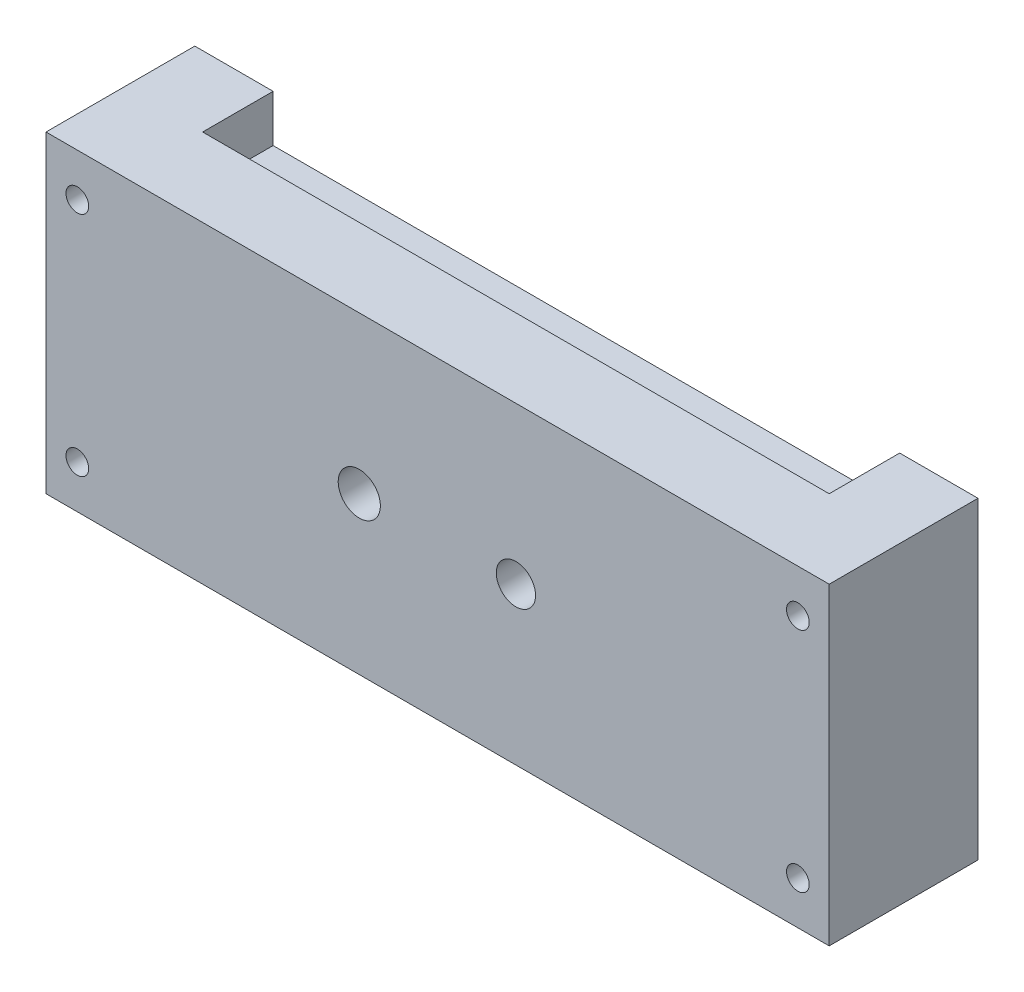
ISO-10303-21;
HEADER;
FILE_DESCRIPTION(('STEP AP214'),'2;1');
FILE_NAME('part.step','',(''),(''),'','','');
FILE_SCHEMA(('AUTOMOTIVE_DESIGN { 1 0 10303 214 1 1 1 1 }'));
ENDSEC;
DATA;
#1=APPLICATION_CONTEXT('core data for automotive mechanical design processes');
#2=APPLICATION_PROTOCOL_DEFINITION('international standard','automotive_design',2000,#1);
#3=PRODUCT_CONTEXT('',#1,'mechanical');
#4=PRODUCT('Part','Part','',(#3));
#5=PRODUCT_RELATED_PRODUCT_CATEGORY('part','',(#4));
#6=PRODUCT_DEFINITION_FORMATION('','',#4);
#7=PRODUCT_DEFINITION_CONTEXT('part definition',#1,'design');
#8=PRODUCT_DEFINITION('design','',#6,#7);
#9=PRODUCT_DEFINITION_SHAPE('','',#8);
#10=(LENGTH_UNIT() NAMED_UNIT(*) SI_UNIT(.MILLI.,.METRE.));
#11=(NAMED_UNIT(*) PLANE_ANGLE_UNIT() SI_UNIT($,.RADIAN.));
#12=(NAMED_UNIT(*) SI_UNIT($,.STERADIAN.) SOLID_ANGLE_UNIT());
#13=UNCERTAINTY_MEASURE_WITH_UNIT(LENGTH_MEASURE(1.E-05),#10,'distance_accuracy_value','');
#14=(GEOMETRIC_REPRESENTATION_CONTEXT(3) GLOBAL_UNCERTAINTY_ASSIGNED_CONTEXT((#13)) GLOBAL_UNIT_ASSIGNED_CONTEXT((#10,
#11,#12)) REPRESENTATION_CONTEXT('',''));
#15=CARTESIAN_POINT('',(0.,0.,0.));
#16=DIRECTION('',(0.,0.,1.));
#17=DIRECTION('',(1.,0.,0.));
#18=AXIS2_PLACEMENT_3D('',#15,#16,#17);
#19=CARTESIAN_POINT('',(56.25,9.0625,9.));
#20=DIRECTION('',(0.,1.,0.));
#21=DIRECTION('',(-1.,0.,0.));
#22=AXIS2_PLACEMENT_3D('',#19,#20,#21);
#23=PLANE('',#22);
#24=DIRECTION('',(0.,0.,-1.));
#25=VECTOR('',#24,1.);
#26=CARTESIAN_POINT('',(56.25,9.0625,9.));
#27=LINE('',#26,#25);
#28=CARTESIAN_POINT('',(56.25,9.0625,2.));
#29=VERTEX_POINT('',#28);
#30=CARTESIAN_POINT('',(56.25,9.0625,0.));
#31=VERTEX_POINT('',#30);
#32=EDGE_CURVE('E383',#29,#31,#27,.T.);
#33=ORIENTED_EDGE('',*,*,#32,.F.);
#34=DIRECTION('',(-1.,0.,0.));
#35=VECTOR('',#34,1.);
#36=CARTESIAN_POINT('',(56.25,9.06250000000001,2.));
#37=LINE('',#36,#35);
#38=CARTESIAN_POINT('',(-33.75,9.06250000000001,2.));
#39=VERTEX_POINT('',#38);
#40=EDGE_CURVE('E271',#29,#39,#37,.T.);
#41=ORIENTED_EDGE('',*,*,#40,.T.);
#42=DIRECTION('',(0.,0.,-1.));
#43=VECTOR('',#42,1.);
#44=CARTESIAN_POINT('',(-33.75,9.06250000000001,27.02775637732));
#45=LINE('',#44,#43);
#46=CARTESIAN_POINT('',(-33.75,9.06250000000001,0.));
#47=VERTEX_POINT('',#46);
#48=EDGE_CURVE('E322',#39,#47,#45,.T.);
#49=ORIENTED_EDGE('',*,*,#48,.T.);
#50=DIRECTION('',(1.,0.,0.));
#51=VECTOR('',#50,1.);
#52=CARTESIAN_POINT('',(56.25,9.0625,0.));
#53=LINE('',#52,#51);
#54=EDGE_CURVE('E366',#47,#31,#53,.T.);
#55=ORIENTED_EDGE('',*,*,#54,.T.);
#56=EDGE_LOOP('',(#33,#41,#49,#55));
#57=FACE_BOUND('',#56,.T.);
#58=ADVANCED_FACE('F33',(#57),#23,.F.);
#59=CARTESIAN_POINT('',(56.25,-5.9375,9.));
#60=DIRECTION('',(0.,-1.,0.));
#61=DIRECTION('',(1.,0.,0.));
#62=AXIS2_PLACEMENT_3D('',#59,#60,#61);
#63=PLANE('',#62);
#64=DIRECTION('',(0.,0.,-1.));
#65=VECTOR('',#64,1.);
#66=CARTESIAN_POINT('',(56.25,-5.9375,9.));
#67=LINE('',#66,#65);
#68=CARTESIAN_POINT('',(56.25,-5.9375,9.));
#69=VERTEX_POINT('',#68);
#70=CARTESIAN_POINT('',(56.25,-5.9375,6.));
#71=VERTEX_POINT('',#70);
#72=EDGE_CURVE('E384',#69,#71,#67,.T.);
#73=ORIENTED_EDGE('',*,*,#72,.T.);
#74=DIRECTION('',(-1.,0.,0.));
#75=VECTOR('',#74,1.);
#76=CARTESIAN_POINT('',(56.25,-5.93749999999998,6.));
#77=LINE('',#76,#75);
#78=CARTESIAN_POINT('',(-33.75,-5.93749999999998,6.));
#79=VERTEX_POINT('',#78);
#80=EDGE_CURVE('E275',#71,#79,#77,.T.);
#81=ORIENTED_EDGE('',*,*,#80,.T.);
#82=DIRECTION('',(0.,0.,-1.));
#83=VECTOR('',#82,1.);
#84=CARTESIAN_POINT('',(-33.75,-5.93749999999998,27.02775637732));
#85=LINE('',#84,#83);
#86=CARTESIAN_POINT('',(-33.75,-5.93749999999998,9.00000000000001));
#87=VERTEX_POINT('',#86);
#88=EDGE_CURVE('E323',#87,#79,#85,.T.);
#89=ORIENTED_EDGE('',*,*,#88,.F.);
#90=DIRECTION('',(-1.,0.,0.));
#91=VECTOR('',#90,1.);
#92=CARTESIAN_POINT('',(56.25,-5.9375,9.));
#93=LINE('',#92,#91);
#94=EDGE_CURVE('E365',#69,#87,#93,.T.);
#95=ORIENTED_EDGE('',*,*,#94,.F.);
#96=EDGE_LOOP('',(#73,#81,#89,#95));
#97=FACE_BOUND('',#96,.T.);
#98=ADVANCED_FACE('F489',(#97),#63,.F.);
#99=CARTESIAN_POINT('',(56.25,1.5625,9.));
#100=DIRECTION('',(0.,0.,-1.));
#101=DIRECTION('',(-1.,0.,0.));
#102=AXIS2_PLACEMENT_3D('',#99,#100,#101);
#103=PLANE('',#102);
#104=CARTESIAN_POINT('',(26.25,1.5625,9.));
#105=DIRECTION('',(0.,0.,-1.));
#106=DIRECTION('',(-1.,0.,0.));
#107=AXIS2_PLACEMENT_3D('',#104,#105,#106);
#108=CIRCLE('',#107,2.50686291163717);
#109=CARTESIAN_POINT('',(23.7431370883628,1.5625,9.));
#110=VERTEX_POINT('',#109);
#111=EDGE_CURVE('E350',#110,#110,#108,.T.);
#112=ORIENTED_EDGE('',*,*,#111,.F.);
#113=EDGE_LOOP('',(#112));
#114=FACE_BOUND('',#113,.T.);
#115=CARTESIAN_POINT('',(26.25,1.5625,9.));
#116=DIRECTION('',(0.,0.,-1.));
#117=DIRECTION('',(-1.,0.,0.));
#118=AXIS2_PLACEMENT_3D('',#115,#116,#117);
#119=CIRCLE('',#118,4.572);
#120=CARTESIAN_POINT('',(21.678,1.5625,9.));
#121=VERTEX_POINT('',#120);
#122=EDGE_CURVE('E334',#121,#121,#119,.T.);
#123=ORIENTED_EDGE('',*,*,#122,.T.);
#124=EDGE_LOOP('',(#123));
#125=FACE_BOUND('',#124,.T.);
#126=ADVANCED_FACE('F496',(#114,#125),#103,.T.);
#127=CARTESIAN_POINT('',(6.25,1.5625,9.));
#128=DIRECTION('',(0.,0.,-1.));
#129=DIRECTION('',(-1.,0.,0.));
#130=AXIS2_PLACEMENT_3D('',#127,#128,#129);
#131=CIRCLE('',#130,2.6931154160579);
#132=CARTESIAN_POINT('',(3.5568845839421,1.5625,9.));
#133=VERTEX_POINT('',#132);
#134=EDGE_CURVE('E333',#133,#133,#131,.T.);
#135=ORIENTED_EDGE('',*,*,#134,.F.);
#136=EDGE_LOOP('',(#135));
#137=FACE_BOUND('',#136,.T.);
#138=CARTESIAN_POINT('',(6.25,1.5625,9.));
#139=DIRECTION('',(0.,0.,-1.));
#140=DIRECTION('',(-1.,0.,0.));
#141=AXIS2_PLACEMENT_3D('',#138,#139,#140);
#142=CIRCLE('',#141,4.572);
#143=CARTESIAN_POINT('',(1.678,1.5625,9.));
#144=VERTEX_POINT('',#143);
#145=EDGE_CURVE('E318',#144,#144,#142,.T.);
#146=ORIENTED_EDGE('',*,*,#145,.T.);
#147=EDGE_LOOP('',(#146));
#148=FACE_BOUND('',#147,.T.);
#149=ADVANCED_FACE('F598',(#137,#148),#103,.T.);
#150=CARTESIAN_POINT('',(-33.75,21.5625,38.));
#151=DIRECTION('',(1.,0.,0.));
#152=DIRECTION('',(0.,0.,-1.));
#153=AXIS2_PLACEMENT_3D('',#150,#151,#152);
#154=PLANE('',#153);
#155=ORIENTED_EDGE('',*,*,#48,.F.);
#156=DIRECTION('',(0.,-1.,0.));
#157=VECTOR('',#156,1.);
#158=CARTESIAN_POINT('',(-33.75,9.06250000000001,2.));
#159=LINE('',#158,#157);
#160=CARTESIAN_POINT('',(-33.75,11.5625,2.));
#161=VERTEX_POINT('',#160);
#162=EDGE_CURVE('E272',#161,#39,#159,.T.);
#163=ORIENTED_EDGE('',*,*,#162,.F.);
#164=DIRECTION('',(0.,0.,-1.));
#165=VECTOR('',#164,1.);
#166=CARTESIAN_POINT('',(-33.75,11.5625,2.));
#167=LINE('',#166,#165);
#168=CARTESIAN_POINT('',(-33.75,11.5625,6.));
#169=VERTEX_POINT('',#168);
#170=EDGE_CURVE('E262',#169,#161,#167,.T.);
#171=ORIENTED_EDGE('',*,*,#170,.F.);
#172=DIRECTION('',(0.,1.,0.));
#173=VECTOR('',#172,1.);
#174=CARTESIAN_POINT('',(-33.75,9.06250000000001,6.));
#175=LINE('',#174,#173);
#176=CARTESIAN_POINT('',(-33.75,9.06250000000001,6.));
#177=VERTEX_POINT('',#176);
#178=EDGE_CURVE('E274',#177,#169,#175,.T.);
#179=ORIENTED_EDGE('',*,*,#178,.F.);
#180=CARTESIAN_POINT('',(-33.75,9.06250000000001,9.));
#181=VERTEX_POINT('',#180);
#182=EDGE_CURVE('E319',#181,#177,#45,.T.);
#183=ORIENTED_EDGE('',*,*,#182,.F.);
#184=DIRECTION('',(0.,-1.,0.));
#185=VECTOR('',#184,1.);
#186=CARTESIAN_POINT('',(-33.75,9.06250000000001,9.));
#187=LINE('',#186,#185);
#188=EDGE_CURVE('E315',#181,#87,#187,.T.);
#189=ORIENTED_EDGE('',*,*,#188,.T.);
#190=ORIENTED_EDGE('',*,*,#88,.T.);
#191=DIRECTION('',(0.,1.,0.));
#192=VECTOR('',#191,1.);
#193=CARTESIAN_POINT('',(-33.75,-5.93749999999998,6.));
#194=LINE('',#193,#192);
#195=CARTESIAN_POINT('',(-33.75,-8.43749999999999,6.));
#196=VERTEX_POINT('',#195);
#197=EDGE_CURVE('E293',#196,#79,#194,.T.);
#198=ORIENTED_EDGE('',*,*,#197,.F.);
#199=DIRECTION('',(0.,0.,1.));
#200=VECTOR('',#199,1.);
#201=CARTESIAN_POINT('',(-33.75,-8.43749999999998,2.));
#202=LINE('',#201,#200);
#203=CARTESIAN_POINT('',(-33.75,-8.43749999999998,2.));
#204=VERTEX_POINT('',#203);
#205=EDGE_CURVE('E304',#204,#196,#202,.T.);
#206=ORIENTED_EDGE('',*,*,#205,.F.);
#207=DIRECTION('',(0.,-1.,0.));
#208=VECTOR('',#207,1.);
#209=CARTESIAN_POINT('',(-33.75,-5.93749999999999,2.));
#210=LINE('',#209,#208);
#211=CARTESIAN_POINT('',(-33.75,-5.93749999999999,2.));
#212=VERTEX_POINT('',#211);
#213=EDGE_CURVE('E228',#212,#204,#210,.T.);
#214=ORIENTED_EDGE('',*,*,#213,.F.);
#215=CARTESIAN_POINT('',(-33.75,-5.93749999999998,0.));
#216=VERTEX_POINT('',#215);
#217=EDGE_CURVE('E282',#212,#216,#85,.T.);
#218=ORIENTED_EDGE('',*,*,#217,.T.);
#219=DIRECTION('',(0.,-1.,0.));
#220=VECTOR('',#219,1.);
#221=CARTESIAN_POINT('',(-33.75,21.5625,0.));
#222=LINE('',#221,#220);
#223=CARTESIAN_POINT('',(-33.75,-18.4375,0.));
#224=VERTEX_POINT('',#223);
#225=EDGE_CURVE('E417',#216,#224,#222,.T.);
#226=ORIENTED_EDGE('',*,*,#225,.T.);
#227=DIRECTION('',(0.,0.,-1.));
#228=VECTOR('',#227,1.);
#229=CARTESIAN_POINT('',(-33.75,-18.4375,38.));
#230=LINE('',#229,#228);
#231=CARTESIAN_POINT('',(-33.75,-18.4375,19.));
#232=VERTEX_POINT('',#231);
#233=EDGE_CURVE('E11',#232,#224,#230,.T.);
#234=ORIENTED_EDGE('',*,*,#233,.F.);
#235=DIRECTION('',(0.,1.,0.));
#236=VECTOR('',#235,1.);
#237=CARTESIAN_POINT('',(-33.75,-18.4375,19.));
#238=LINE('',#237,#236);
#239=CARTESIAN_POINT('',(-33.75,21.5625,19.));
#240=VERTEX_POINT('',#239);
#241=EDGE_CURVE('E392',#232,#240,#238,.T.);
#242=ORIENTED_EDGE('',*,*,#241,.T.);
#243=DIRECTION('',(0.,0.,-1.));
#244=VECTOR('',#243,1.);
#245=CARTESIAN_POINT('',(-33.75,21.5625,38.));
#246=LINE('',#245,#244);
#247=CARTESIAN_POINT('',(-33.75,21.5625,0.));
#248=VERTEX_POINT('',#247);
#249=EDGE_CURVE('E432',#240,#248,#246,.T.);
#250=ORIENTED_EDGE('',*,*,#249,.T.);
#251=EDGE_CURVE('E418',#248,#47,#222,.T.);
#252=ORIENTED_EDGE('',*,*,#251,.T.);
#253=EDGE_LOOP('',(#155,#163,#171,#179,#183,#189,#190,#198,#206,#214,#218,#226,#234,#242,#250,#252));
#254=FACE_BOUND('',#253,.T.);
#255=ADVANCED_FACE('F35',(#254),#154,.F.);
#256=CARTESIAN_POINT('',(-33.75,-18.4375,38.));
#257=DIRECTION('',(0.,1.,0.));
#258=DIRECTION('',(0.,0.,1.));
#259=AXIS2_PLACEMENT_3D('',#256,#257,#258);
#260=PLANE('',#259);
#261=DIRECTION('',(-1.,0.,0.));
#262=VECTOR('',#261,1.);
#263=CARTESIAN_POINT('',(56.25,-18.4375,8.99999999999998));
#264=LINE('',#263,#262);
#265=CARTESIAN_POINT('',(56.25,-18.4375,8.99999999999998));
#266=VERTEX_POINT('',#265);
#267=CARTESIAN_POINT('',(-23.75,-18.4375,8.99999999999998));
#268=VERTEX_POINT('',#267);
#269=EDGE_CURVE('E233',#266,#268,#264,.T.);
#270=ORIENTED_EDGE('',*,*,#269,.F.);
#271=DIRECTION('',(0.,0.,-1.));
#272=VECTOR('',#271,1.);
#273=CARTESIAN_POINT('',(56.25,-18.4375,8.99999999999998));
#274=LINE('',#273,#272);
#275=CARTESIAN_POINT('',(56.25,-18.4375,0.));
#276=VERTEX_POINT('',#275);
#277=EDGE_CURVE('E224',#266,#276,#274,.T.);
#278=ORIENTED_EDGE('',*,*,#277,.T.);
#279=DIRECTION('',(1.,0.,0.));
#280=VECTOR('',#279,1.);
#281=CARTESIAN_POINT('',(-33.75,-18.4375,0.));
#282=LINE('',#281,#280);
#283=CARTESIAN_POINT('',(66.25,-18.4375,0.));
#284=VERTEX_POINT('',#283);
#285=EDGE_CURVE('E421',#276,#284,#282,.T.);
#286=ORIENTED_EDGE('',*,*,#285,.T.);
#287=DIRECTION('',(0.,0.,-1.));
#288=VECTOR('',#287,1.);
#289=CARTESIAN_POINT('',(66.25,-18.4375,38.));
#290=LINE('',#289,#288);
#291=CARTESIAN_POINT('',(66.25,-18.4375,19.));
#292=VERTEX_POINT('',#291);
#293=EDGE_CURVE('E42',#292,#284,#290,.T.);
#294=ORIENTED_EDGE('',*,*,#293,.F.);
#295=DIRECTION('',(-1.,0.,0.));
#296=VECTOR('',#295,1.);
#297=CARTESIAN_POINT('',(66.25,-18.4375,19.));
#298=LINE('',#297,#296);
#299=EDGE_CURVE('E387',#292,#232,#298,.T.);
#300=ORIENTED_EDGE('',*,*,#299,.T.);
#301=ORIENTED_EDGE('',*,*,#233,.T.);
#302=CARTESIAN_POINT('',(-23.75,-18.4375,0.));
#303=VERTEX_POINT('',#302);
#304=EDGE_CURVE('E422',#224,#303,#282,.T.);
#305=ORIENTED_EDGE('',*,*,#304,.T.);
#306=DIRECTION('',(0.,0.,-1.));
#307=VECTOR('',#306,1.);
#308=CARTESIAN_POINT('',(-23.75,-18.4375,8.99999999999998));
#309=LINE('',#308,#307);
#310=EDGE_CURVE('E57',#268,#303,#309,.T.);
#311=ORIENTED_EDGE('',*,*,#310,.F.);
#312=EDGE_LOOP('',(#270,#278,#286,#294,#300,#301,#305,#311));
#313=FACE_BOUND('',#312,.T.);
#314=ADVANCED_FACE('F464',(#313),#260,.F.);
#315=CARTESIAN_POINT('',(66.25,21.5625,38.));
#316=DIRECTION('',(-1.,0.,0.));
#317=DIRECTION('',(0.,0.,1.));
#318=AXIS2_PLACEMENT_3D('',#315,#316,#317);
#319=PLANE('',#318);
#320=DIRECTION('',(0.,0.,-1.));
#321=VECTOR('',#320,1.);
#322=CARTESIAN_POINT('',(66.25,21.5625,38.));
#323=LINE('',#322,#321);
#324=CARTESIAN_POINT('',(66.25,21.5625,19.));
#325=VERTEX_POINT('',#324);
#326=CARTESIAN_POINT('',(66.25,21.5625,0.));
#327=VERTEX_POINT('',#326);
#328=EDGE_CURVE('E435',#325,#327,#323,.T.);
#329=ORIENTED_EDGE('',*,*,#328,.F.);
#330=DIRECTION('',(0.,1.,0.));
#331=VECTOR('',#330,1.);
#332=CARTESIAN_POINT('',(66.25,-18.4375,19.));
#333=LINE('',#332,#331);
#334=EDGE_CURVE('E390',#292,#325,#333,.T.);
#335=ORIENTED_EDGE('',*,*,#334,.F.);
#336=ORIENTED_EDGE('',*,*,#293,.T.);
#337=DIRECTION('',(0.,1.,0.));
#338=VECTOR('',#337,1.);
#339=CARTESIAN_POINT('',(66.25,21.5625,0.));
#340=LINE('',#339,#338);
#341=EDGE_CURVE('E425',#284,#327,#340,.T.);
#342=ORIENTED_EDGE('',*,*,#341,.T.);
#343=EDGE_LOOP('',(#329,#335,#336,#342));
#344=FACE_BOUND('',#343,.T.);
#345=ADVANCED_FACE('F443',(#344),#319,.F.);
#346=CARTESIAN_POINT('',(-33.75,21.5625,38.));
#347=DIRECTION('',(0.,-1.,0.));
#348=DIRECTION('',(0.,0.,-1.));
#349=AXIS2_PLACEMENT_3D('',#346,#347,#348);
#350=PLANE('',#349);
#351=DIRECTION('',(-1.,0.,0.));
#352=VECTOR('',#351,1.);
#353=CARTESIAN_POINT('',(-33.75,21.5625,0.));
#354=LINE('',#353,#352);
#355=CARTESIAN_POINT('',(56.25,21.5625,0.));
#356=VERTEX_POINT('',#355);
#357=EDGE_CURVE('E429',#327,#356,#354,.T.);
#358=ORIENTED_EDGE('',*,*,#357,.T.);
#359=DIRECTION('',(0.,0.,-1.));
#360=VECTOR('',#359,1.);
#361=CARTESIAN_POINT('',(56.25,21.5625,8.99999999999998));
#362=LINE('',#361,#360);
#363=CARTESIAN_POINT('',(56.25,21.5625,8.99999999999998));
#364=VERTEX_POINT('',#363);
#365=EDGE_CURVE('E226',#364,#356,#362,.T.);
#366=ORIENTED_EDGE('',*,*,#365,.F.);
#367=DIRECTION('',(1.,0.,0.));
#368=VECTOR('',#367,1.);
#369=CARTESIAN_POINT('',(56.25,21.5625,8.99999999999998));
#370=LINE('',#369,#368);
#371=CARTESIAN_POINT('',(-23.75,21.5625,8.99999999999998));
#372=VERTEX_POINT('',#371);
#373=EDGE_CURVE('E203',#372,#364,#370,.T.);
#374=ORIENTED_EDGE('',*,*,#373,.F.);
#375=DIRECTION('',(0.,0.,-1.));
#376=VECTOR('',#375,1.);
#377=CARTESIAN_POINT('',(-23.75,21.5625,8.99999999999998));
#378=LINE('',#377,#376);
#379=CARTESIAN_POINT('',(-23.75,21.5625,0.));
#380=VERTEX_POINT('',#379);
#381=EDGE_CURVE('E229',#372,#380,#378,.T.);
#382=ORIENTED_EDGE('',*,*,#381,.T.);
#383=EDGE_CURVE('E428',#380,#248,#354,.T.);
#384=ORIENTED_EDGE('',*,*,#383,.T.);
#385=ORIENTED_EDGE('',*,*,#249,.F.);
#386=DIRECTION('',(-1.,0.,0.));
#387=VECTOR('',#386,1.);
#388=CARTESIAN_POINT('',(66.25,21.5625,19.));
#389=LINE('',#388,#387);
#390=EDGE_CURVE('E382',#325,#240,#389,.T.);
#391=ORIENTED_EDGE('',*,*,#390,.F.);
#392=ORIENTED_EDGE('',*,*,#328,.T.);
#393=EDGE_LOOP('',(#358,#366,#374,#382,#384,#385,#391,#392));
#394=FACE_BOUND('',#393,.T.);
#395=ADVANCED_FACE('F451',(#394),#350,.F.);
#396=CARTESIAN_POINT('',(0.,0.,0.));
#397=DIRECTION('',(0.,0.,1.));
#398=DIRECTION('',(1.,0.,0.));
#399=AXIS2_PLACEMENT_3D('',#396,#397,#398);
#400=PLANE('',#399);
#401=CARTESIAN_POINT('',(62.25,-12.9375,0.));
#402=DIRECTION('',(0.,0.,-1.));
#403=DIRECTION('',(-1.,0.,0.));
#404=AXIS2_PLACEMENT_3D('',#401,#402,#403);
#405=CIRCLE('',#404,1.45);
#406=CARTESIAN_POINT('',(60.8,-12.9375,0.));
#407=VERTEX_POINT('',#406);
#408=EDGE_CURVE('E409',#407,#407,#405,.T.);
#409=ORIENTED_EDGE('',*,*,#408,.F.);
#410=EDGE_LOOP('',(#409));
#411=FACE_BOUND('',#410,.T.);
#412=CARTESIAN_POINT('',(-29.75,16.0625,0.));
#413=DIRECTION('',(0.,0.,-1.));
#414=DIRECTION('',(-1.,0.,0.));
#415=AXIS2_PLACEMENT_3D('',#412,#413,#414);
#416=CIRCLE('',#415,1.45);
#417=CARTESIAN_POINT('',(-31.2,16.0625,0.));
#418=VERTEX_POINT('',#417);
#419=EDGE_CURVE('E408',#418,#418,#416,.T.);
#420=ORIENTED_EDGE('',*,*,#419,.F.);
#421=EDGE_LOOP('',(#420));
#422=FACE_BOUND('',#421,.T.);
#423=CARTESIAN_POINT('',(-29.75,-12.9375,0.));
#424=DIRECTION('',(0.,0.,-1.));
#425=DIRECTION('',(-1.,0.,0.));
#426=AXIS2_PLACEMENT_3D('',#423,#424,#425);
#427=CIRCLE('',#426,1.45);
#428=CARTESIAN_POINT('',(-31.2,-12.9375,0.));
#429=VERTEX_POINT('',#428);
#430=EDGE_CURVE('E405',#429,#429,#427,.T.);
#431=ORIENTED_EDGE('',*,*,#430,.F.);
#432=EDGE_LOOP('',(#431));
#433=FACE_BOUND('',#432,.T.);
#434=CARTESIAN_POINT('',(62.25,16.0625,0.));
#435=DIRECTION('',(0.,0.,-1.));
#436=DIRECTION('',(-1.,0.,0.));
#437=AXIS2_PLACEMENT_3D('',#434,#435,#436);
#438=CIRCLE('',#437,1.45);
#439=CARTESIAN_POINT('',(60.8,16.0625,0.));
#440=VERTEX_POINT('',#439);
#441=EDGE_CURVE('E412',#440,#440,#438,.T.);
#442=ORIENTED_EDGE('',*,*,#441,.F.);
#443=EDGE_LOOP('',(#442));
#444=FACE_BOUND('',#443,.T.);
#445=DIRECTION('',(-1.,0.,0.));
#446=VECTOR('',#445,1.);
#447=CARTESIAN_POINT('',(56.25,15.5625,0.));
#448=LINE('',#447,#446);
#449=CARTESIAN_POINT('',(56.25,15.5625,0.));
#450=VERTEX_POINT('',#449);
#451=CARTESIAN_POINT('',(-23.75,15.5625,0.));
#452=VERTEX_POINT('',#451);
#453=EDGE_CURVE('E218',#450,#452,#448,.T.);
#454=ORIENTED_EDGE('',*,*,#453,.F.);
#455=DIRECTION('',(0.,-1.,0.));
#456=VECTOR('',#455,1.);
#457=CARTESIAN_POINT('',(56.25,21.5625,0.));
#458=LINE('',#457,#456);
#459=EDGE_CURVE('E49',#356,#450,#458,.T.);
#460=ORIENTED_EDGE('',*,*,#459,.F.);
#461=ORIENTED_EDGE('',*,*,#357,.F.);
#462=ORIENTED_EDGE('',*,*,#341,.F.);
#463=ORIENTED_EDGE('',*,*,#285,.F.);
#464=DIRECTION('',(0.,-1.,0.));
#465=VECTOR('',#464,1.);
#466=CARTESIAN_POINT('',(56.25,-18.4375,0.));
#467=LINE('',#466,#465);
#468=CARTESIAN_POINT('',(56.25,-12.4375,0.));
#469=VERTEX_POINT('',#468);
#470=EDGE_CURVE('E237',#469,#276,#467,.T.);
#471=ORIENTED_EDGE('',*,*,#470,.F.);
#472=DIRECTION('',(1.,0.,0.));
#473=VECTOR('',#472,1.);
#474=CARTESIAN_POINT('',(56.25,-12.4375,0.));
#475=LINE('',#474,#473);
#476=CARTESIAN_POINT('',(-23.75,-12.4375,0.));
#477=VERTEX_POINT('',#476);
#478=EDGE_CURVE('E248',#477,#469,#475,.T.);
#479=ORIENTED_EDGE('',*,*,#478,.F.);
#480=DIRECTION('',(0.,1.,0.));
#481=VECTOR('',#480,1.);
#482=CARTESIAN_POINT('',(-23.75,-18.4375,0.));
#483=LINE('',#482,#481);
#484=EDGE_CURVE('E246',#303,#477,#483,.T.);
#485=ORIENTED_EDGE('',*,*,#484,.F.);
#486=ORIENTED_EDGE('',*,*,#304,.F.);
#487=ORIENTED_EDGE('',*,*,#225,.F.);
#488=DIRECTION('',(-1.,0.,0.));
#489=VECTOR('',#488,1.);
#490=CARTESIAN_POINT('',(56.25,-5.9375,0.));
#491=LINE('',#490,#489);
#492=CARTESIAN_POINT('',(56.25,-5.9375,0.));
#493=VERTEX_POINT('',#492);
#494=EDGE_CURVE('E374',#493,#216,#491,.T.);
#495=ORIENTED_EDGE('',*,*,#494,.F.);
#496=CARTESIAN_POINT('',(56.25,1.5625,0.));
#497=DIRECTION('',(0.,0.,-1.));
#498=DIRECTION('',(-1.,0.,0.));
#499=AXIS2_PLACEMENT_3D('',#496,#497,#498);
#500=CIRCLE('',#499,7.5);
#501=EDGE_CURVE('E357',#31,#493,#500,.T.);
#502=ORIENTED_EDGE('',*,*,#501,.F.);
#503=ORIENTED_EDGE('',*,*,#54,.F.);
#504=ORIENTED_EDGE('',*,*,#251,.F.);
#505=ORIENTED_EDGE('',*,*,#383,.F.);
#506=DIRECTION('',(0.,1.,0.));
#507=VECTOR('',#506,1.);
#508=CARTESIAN_POINT('',(-23.75,21.5625,0.));
#509=LINE('',#508,#507);
#510=EDGE_CURVE('E216',#452,#380,#509,.T.);
#511=ORIENTED_EDGE('',*,*,#510,.F.);
#512=EDGE_LOOP('',(#454,#460,#461,#462,#463,#471,#479,#485,#486,#487,#495,#502,#503,#504,#505,#511));
#513=FACE_BOUND('',#512,.T.);
#514=ADVANCED_FACE('F448',(#411,#422,#433,#444,#513),#400,.F.);
#515=CARTESIAN_POINT('',(62.25,16.0625,38.001));
#516=DIRECTION('',(0.,0.,-1.));
#517=DIRECTION('',(-1.,0.,0.));
#518=AXIS2_PLACEMENT_3D('',#515,#516,#517);
#519=CYLINDRICAL_SURFACE('',#518,1.45);
#520=CARTESIAN_POINT('',(62.25,16.0625,19.));
#521=DIRECTION('',(0.,0.,-1.));
#522=DIRECTION('',(-1.,0.,0.));
#523=AXIS2_PLACEMENT_3D('',#520,#521,#522);
#524=CIRCLE('',#523,1.45);
#525=CARTESIAN_POINT('',(60.8,16.0625,19.));
#526=VERTEX_POINT('',#525);
#527=EDGE_CURVE('E402',#526,#526,#524,.F.);
#528=ORIENTED_EDGE('',*,*,#527,.T.);
#529=EDGE_LOOP('',(#528));
#530=FACE_BOUND('',#529,.T.);
#531=ORIENTED_EDGE('',*,*,#441,.T.);
#532=EDGE_LOOP('',(#531));
#533=FACE_BOUND('',#532,.T.);
#534=ADVANCED_FACE('F633',(#530,#533),#519,.F.);
#535=CARTESIAN_POINT('',(-29.75,-12.9375,38.001));
#536=DIRECTION('',(0.,0.,-1.));
#537=DIRECTION('',(-1.,0.,0.));
#538=AXIS2_PLACEMENT_3D('',#535,#536,#537);
#539=CYLINDRICAL_SURFACE('',#538,1.45);
#540=CARTESIAN_POINT('',(-29.75,-12.9375,19.));
#541=DIRECTION('',(0.,0.,-1.));
#542=DIRECTION('',(-1.,0.,0.));
#543=AXIS2_PLACEMENT_3D('',#540,#541,#542);
#544=CIRCLE('',#543,1.45);
#545=CARTESIAN_POINT('',(-31.2,-12.9375,19.));
#546=VERTEX_POINT('',#545);
#547=EDGE_CURVE('E399',#546,#546,#544,.F.);
#548=ORIENTED_EDGE('',*,*,#547,.T.);
#549=EDGE_LOOP('',(#548));
#550=FACE_BOUND('',#549,.T.);
#551=ORIENTED_EDGE('',*,*,#430,.T.);
#552=EDGE_LOOP('',(#551));
#553=FACE_BOUND('',#552,.T.);
#554=ADVANCED_FACE('F642',(#550,#553),#539,.F.);
#555=CARTESIAN_POINT('',(-29.75,16.0625,38.001));
#556=DIRECTION('',(0.,0.,-1.));
#557=DIRECTION('',(-1.,0.,0.));
#558=AXIS2_PLACEMENT_3D('',#555,#556,#557);
#559=CYLINDRICAL_SURFACE('',#558,1.45);
#560=CARTESIAN_POINT('',(-29.75,16.0625,19.));
#561=DIRECTION('',(0.,0.,-1.));
#562=DIRECTION('',(-1.,0.,0.));
#563=AXIS2_PLACEMENT_3D('',#560,#561,#562);
#564=CIRCLE('',#563,1.45);
#565=CARTESIAN_POINT('',(-31.2,16.0625,19.));
#566=VERTEX_POINT('',#565);
#567=EDGE_CURVE('E396',#566,#566,#564,.F.);
#568=ORIENTED_EDGE('',*,*,#567,.T.);
#569=EDGE_LOOP('',(#568));
#570=FACE_BOUND('',#569,.T.);
#571=ORIENTED_EDGE('',*,*,#419,.T.);
#572=EDGE_LOOP('',(#571));
#573=FACE_BOUND('',#572,.T.);
#574=ADVANCED_FACE('F627',(#570,#573),#559,.F.);
#575=CARTESIAN_POINT('',(62.25,-12.9375,38.001));
#576=DIRECTION('',(0.,0.,-1.));
#577=DIRECTION('',(-1.,0.,0.));
#578=AXIS2_PLACEMENT_3D('',#575,#576,#577);
#579=CYLINDRICAL_SURFACE('',#578,1.45);
#580=CARTESIAN_POINT('',(62.25,-12.9375,19.));
#581=DIRECTION('',(0.,0.,-1.));
#582=DIRECTION('',(-1.,0.,0.));
#583=AXIS2_PLACEMENT_3D('',#580,#581,#582);
#584=CIRCLE('',#583,1.45);
#585=CARTESIAN_POINT('',(60.8,-12.9375,19.));
#586=VERTEX_POINT('',#585);
#587=EDGE_CURVE('E37',#586,#586,#584,.F.);
#588=ORIENTED_EDGE('',*,*,#587,.T.);
#589=EDGE_LOOP('',(#588));
#590=FACE_BOUND('',#589,.T.);
#591=ORIENTED_EDGE('',*,*,#408,.T.);
#592=EDGE_LOOP('',(#591));
#593=FACE_BOUND('',#592,.T.);
#594=ADVANCED_FACE('F617',(#590,#593),#579,.F.);
#595=CARTESIAN_POINT('',(66.25,-18.4375,19.));
#596=DIRECTION('',(0.,0.,-1.));
#597=DIRECTION('',(-1.,0.,0.));
#598=AXIS2_PLACEMENT_3D('',#595,#596,#597);
#599=PLANE('',#598);
#600=CARTESIAN_POINT('',(26.25,1.5625,19.));
#601=DIRECTION('',(0.,0.,-1.));
#602=DIRECTION('',(-1.,0.,0.));
#603=AXIS2_PLACEMENT_3D('',#600,#601,#602);
#604=CIRCLE('',#603,2.50686291163717);
#605=CARTESIAN_POINT('',(23.7431370883628,1.5625,19.));
#606=VERTEX_POINT('',#605);
#607=EDGE_CURVE('E353',#606,#606,#604,.F.);
#608=ORIENTED_EDGE('',*,*,#607,.F.);
#609=EDGE_LOOP('',(#608));
#610=FACE_BOUND('',#609,.T.);
#611=CARTESIAN_POINT('',(6.25,1.5625,19.));
#612=DIRECTION('',(0.,0.,-1.));
#613=DIRECTION('',(-1.,0.,0.));
#614=AXIS2_PLACEMENT_3D('',#611,#612,#613);
#615=CIRCLE('',#614,2.6931154160579);
#616=CARTESIAN_POINT('',(3.5568845839421,1.5625,19.));
#617=VERTEX_POINT('',#616);
#618=EDGE_CURVE('E354',#617,#617,#615,.F.);
#619=ORIENTED_EDGE('',*,*,#618,.F.);
#620=EDGE_LOOP('',(#619));
#621=FACE_BOUND('',#620,.T.);
#622=ORIENTED_EDGE('',*,*,#547,.F.);
#623=EDGE_LOOP('',(#622));
#624=FACE_BOUND('',#623,.T.);
#625=ORIENTED_EDGE('',*,*,#587,.F.);
#626=EDGE_LOOP('',(#625));
#627=FACE_BOUND('',#626,.T.);
#628=ORIENTED_EDGE('',*,*,#390,.T.);
#629=ORIENTED_EDGE('',*,*,#241,.F.);
#630=ORIENTED_EDGE('',*,*,#299,.F.);
#631=ORIENTED_EDGE('',*,*,#334,.T.);
#632=EDGE_LOOP('',(#628,#629,#630,#631));
#633=FACE_BOUND('',#632,.T.);
#634=ORIENTED_EDGE('',*,*,#567,.F.);
#635=EDGE_LOOP('',(#634));
#636=FACE_BOUND('',#635,.T.);
#637=ORIENTED_EDGE('',*,*,#527,.F.);
#638=EDGE_LOOP('',(#637));
#639=FACE_BOUND('',#638,.T.);
#640=ADVANCED_FACE('F455',(#610,#621,#624,#627,#633,#636,#639),#599,.F.);
#641=CARTESIAN_POINT('',(56.25,1.5625,9.));
#642=DIRECTION('',(0.,0.,-1.));
#643=DIRECTION('',(-1.,0.,0.));
#644=AXIS2_PLACEMENT_3D('',#641,#642,#643);
#645=CYLINDRICAL_SURFACE('',#644,7.5);
#646=ORIENTED_EDGE('',*,*,#501,.T.);
#647=CARTESIAN_POINT('',(56.25,-5.93749999999999,2.));
#648=VERTEX_POINT('',#647);
#649=EDGE_CURVE('E371',#648,#493,#67,.T.);
#650=ORIENTED_EDGE('',*,*,#649,.F.);
#651=DIRECTION('',(0.,0.,-1.));
#652=VECTOR('',#651,1.);
#653=CARTESIAN_POINT('',(56.25,-5.93749999999999,2.));
#654=LINE('',#653,#652);
#655=EDGE_CURVE('E289',#71,#648,#654,.T.);
#656=ORIENTED_EDGE('',*,*,#655,.F.);
#657=ORIENTED_EDGE('',*,*,#72,.F.);
#658=CARTESIAN_POINT('',(56.25,1.5625,9.));
#659=DIRECTION('',(0.,0.,-1.));
#660=DIRECTION('',(-1.,0.,0.));
#661=AXIS2_PLACEMENT_3D('',#658,#659,#660);
#662=CIRCLE('',#661,7.5);
#663=CARTESIAN_POINT('',(56.25,9.0625,9.));
#664=VERTEX_POINT('',#663);
#665=EDGE_CURVE('E362',#664,#69,#662,.T.);
#666=ORIENTED_EDGE('',*,*,#665,.F.);
#667=CARTESIAN_POINT('',(56.25,9.06250000000001,6.));
#668=VERTEX_POINT('',#667);
#669=EDGE_CURVE('E379',#664,#668,#27,.T.);
#670=ORIENTED_EDGE('',*,*,#669,.T.);
#671=DIRECTION('',(0.,0.,1.));
#672=VECTOR('',#671,1.);
#673=CARTESIAN_POINT('',(56.25,9.06250000000001,2.));
#674=LINE('',#673,#672);
#675=EDGE_CURVE('E261',#29,#668,#674,.T.);
#676=ORIENTED_EDGE('',*,*,#675,.F.);
#677=ORIENTED_EDGE('',*,*,#32,.T.);
#678=EDGE_LOOP('',(#646,#650,#656,#657,#666,#670,#676,#677));
#679=FACE_BOUND('',#678,.T.);
#680=ADVANCED_FACE('F503',(#679),#645,.F.);
#681=ORIENTED_EDGE('',*,*,#182,.T.);
#682=DIRECTION('',(-1.,0.,0.));
#683=VECTOR('',#682,1.);
#684=CARTESIAN_POINT('',(56.25,9.06250000000001,6.));
#685=LINE('',#684,#683);
#686=EDGE_CURVE('E285',#668,#177,#685,.T.);
#687=ORIENTED_EDGE('',*,*,#686,.F.);
#688=ORIENTED_EDGE('',*,*,#669,.F.);
#689=DIRECTION('',(1.,0.,0.));
#690=VECTOR('',#689,1.);
#691=CARTESIAN_POINT('',(56.25,9.0625,9.));
#692=LINE('',#691,#690);
#693=EDGE_CURVE('E368',#181,#664,#692,.T.);
#694=ORIENTED_EDGE('',*,*,#693,.F.);
#695=EDGE_LOOP('',(#681,#687,#688,#694));
#696=FACE_BOUND('',#695,.T.);
#697=ADVANCED_FACE('F492',(#696),#23,.F.);
#698=ORIENTED_EDGE('',*,*,#217,.F.);
#699=DIRECTION('',(-1.,0.,0.));
#700=VECTOR('',#699,1.);
#701=CARTESIAN_POINT('',(56.25,-5.93749999999999,2.));
#702=LINE('',#701,#700);
#703=EDGE_CURVE('E301',#648,#212,#702,.T.);
#704=ORIENTED_EDGE('',*,*,#703,.F.);
#705=ORIENTED_EDGE('',*,*,#649,.T.);
#706=ORIENTED_EDGE('',*,*,#494,.T.);
#707=EDGE_LOOP('',(#698,#704,#705,#706));
#708=FACE_BOUND('',#707,.T.);
#709=ADVANCED_FACE('F499',(#708),#63,.F.);
#710=ORIENTED_EDGE('',*,*,#94,.T.);
#711=ORIENTED_EDGE('',*,*,#188,.F.);
#712=ORIENTED_EDGE('',*,*,#693,.T.);
#713=ORIENTED_EDGE('',*,*,#665,.T.);
#714=EDGE_LOOP('',(#710,#711,#712,#713));
#715=FACE_BOUND('',#714,.T.);
#716=CARTESIAN_POINT('',(26.25,1.5625,9.));
#717=DIRECTION('',(0.,0.,-1.));
#718=DIRECTION('',(-1.,0.,0.));
#719=AXIS2_PLACEMENT_3D('',#716,#717,#718);
#720=CIRCLE('',#719,6.477);
#721=CARTESIAN_POINT('',(19.773,1.5625,9.));
#722=VERTEX_POINT('',#721);
#723=EDGE_CURVE('E330',#722,#722,#720,.T.);
#724=ORIENTED_EDGE('',*,*,#723,.F.);
#725=EDGE_LOOP('',(#724));
#726=FACE_BOUND('',#725,.T.);
#727=CARTESIAN_POINT('',(6.25,1.5625,9.));
#728=DIRECTION('',(0.,0.,-1.));
#729=DIRECTION('',(-1.,0.,0.));
#730=AXIS2_PLACEMENT_3D('',#727,#728,#729);
#731=CIRCLE('',#730,6.477);
#732=CARTESIAN_POINT('',(-0.227000000000002,1.5625,9.));
#733=VERTEX_POINT('',#732);
#734=EDGE_CURVE('E343',#733,#733,#731,.T.);
#735=ORIENTED_EDGE('',*,*,#734,.F.);
#736=EDGE_LOOP('',(#735));
#737=FACE_BOUND('',#736,.T.);
#738=ADVANCED_FACE('F509',(#715,#726,#737),#103,.T.);
#739=CARTESIAN_POINT('',(6.25,1.5625,19.001));
#740=DIRECTION('',(0.,0.,-1.));
#741=DIRECTION('',(-1.,0.,0.));
#742=AXIS2_PLACEMENT_3D('',#739,#740,#741);
#743=CYLINDRICAL_SURFACE('',#742,2.6931154160579);
#744=ORIENTED_EDGE('',*,*,#134,.T.);
#745=EDGE_LOOP('',(#744));
#746=FACE_BOUND('',#745,.T.);
#747=ORIENTED_EDGE('',*,*,#618,.T.);
#748=EDGE_LOOP('',(#747));
#749=FACE_BOUND('',#748,.T.);
#750=ADVANCED_FACE('F593',(#746,#749),#743,.F.);
#751=CARTESIAN_POINT('',(26.25,1.5625,19.001));
#752=DIRECTION('',(0.,0.,-1.));
#753=DIRECTION('',(-1.,0.,0.));
#754=AXIS2_PLACEMENT_3D('',#751,#752,#753);
#755=CYLINDRICAL_SURFACE('',#754,2.50686291163717);
#756=ORIENTED_EDGE('',*,*,#111,.T.);
#757=EDGE_LOOP('',(#756));
#758=FACE_BOUND('',#757,.T.);
#759=ORIENTED_EDGE('',*,*,#607,.T.);
#760=EDGE_LOOP('',(#759));
#761=FACE_BOUND('',#760,.T.);
#762=ADVANCED_FACE('F589',(#758,#761),#755,.F.);
#763=CARTESIAN_POINT('',(6.25,1.5625,9.79375));
#764=DIRECTION('',(0.,0.,-1.));
#765=DIRECTION('',(-1.,0.,0.));
#766=AXIS2_PLACEMENT_3D('',#763,#764,#765);
#767=CYLINDRICAL_SURFACE('',#766,4.572);
#768=CARTESIAN_POINT('',(6.25,1.5625,9.79375));
#769=DIRECTION('',(0.,0.,-1.));
#770=DIRECTION('',(-1.,0.,0.));
#771=AXIS2_PLACEMENT_3D('',#768,#769,#770);
#772=CIRCLE('',#771,4.572);
#773=CARTESIAN_POINT('',(1.678,1.5625,9.79375));
#774=VERTEX_POINT('',#773);
#775=EDGE_CURVE('E340',#774,#774,#772,.T.);
#776=ORIENTED_EDGE('',*,*,#775,.T.);
#777=EDGE_LOOP('',(#776));
#778=FACE_BOUND('',#777,.T.);
#779=ORIENTED_EDGE('',*,*,#145,.F.);
#780=EDGE_LOOP('',(#779));
#781=FACE_BOUND('',#780,.T.);
#782=ADVANCED_FACE('F585',(#778,#781),#767,.T.);
#783=CARTESIAN_POINT('',(6.25,1.5625,9.79375));
#784=DIRECTION('',(0.,0.,-1.));
#785=DIRECTION('',(-1.,0.,0.));
#786=AXIS2_PLACEMENT_3D('',#783,#784,#785);
#787=CYLINDRICAL_SURFACE('',#786,6.477);
#788=CARTESIAN_POINT('',(6.25,1.5625,9.79375));
#789=DIRECTION('',(0.,0.,-1.));
#790=DIRECTION('',(-1.,0.,0.));
#791=AXIS2_PLACEMENT_3D('',#788,#789,#790);
#792=CIRCLE('',#791,6.477);
#793=CARTESIAN_POINT('',(-0.227000000000002,1.5625,9.79375));
#794=VERTEX_POINT('',#793);
#795=EDGE_CURVE('E337',#794,#794,#792,.T.);
#796=ORIENTED_EDGE('',*,*,#795,.F.);
#797=EDGE_LOOP('',(#796));
#798=FACE_BOUND('',#797,.T.);
#799=ORIENTED_EDGE('',*,*,#734,.T.);
#800=EDGE_LOOP('',(#799));
#801=FACE_BOUND('',#800,.T.);
#802=ADVANCED_FACE('F581',(#798,#801),#787,.F.);
#803=CARTESIAN_POINT('',(0.,0.,9.79375));
#804=DIRECTION('',(0.,0.,-1.));
#805=DIRECTION('',(-1.,0.,0.));
#806=AXIS2_PLACEMENT_3D('',#803,#804,#805);
#807=PLANE('',#806);
#808=ORIENTED_EDGE('',*,*,#775,.F.);
#809=EDGE_LOOP('',(#808));
#810=FACE_BOUND('',#809,.T.);
#811=ORIENTED_EDGE('',*,*,#795,.T.);
#812=EDGE_LOOP('',(#811));
#813=FACE_BOUND('',#812,.T.);
#814=ADVANCED_FACE('F577',(#810,#813),#807,.T.);
#815=CARTESIAN_POINT('',(26.25,1.5625,9.79375));
#816=DIRECTION('',(0.,0.,-1.));
#817=DIRECTION('',(-1.,0.,0.));
#818=AXIS2_PLACEMENT_3D('',#815,#816,#817);
#819=CYLINDRICAL_SURFACE('',#818,4.572);
#820=CARTESIAN_POINT('',(26.25,1.5625,9.79375));
#821=DIRECTION('',(0.,0.,-1.));
#822=DIRECTION('',(-1.,0.,0.));
#823=AXIS2_PLACEMENT_3D('',#820,#821,#822);
#824=CIRCLE('',#823,4.572);
#825=CARTESIAN_POINT('',(21.678,1.5625,9.79375));
#826=VERTEX_POINT('',#825);
#827=EDGE_CURVE('E326',#826,#826,#824,.T.);
#828=ORIENTED_EDGE('',*,*,#827,.T.);
#829=EDGE_LOOP('',(#828));
#830=FACE_BOUND('',#829,.T.);
#831=ORIENTED_EDGE('',*,*,#122,.F.);
#832=EDGE_LOOP('',(#831));
#833=FACE_BOUND('',#832,.T.);
#834=ADVANCED_FACE('F573',(#830,#833),#819,.T.);
#835=CARTESIAN_POINT('',(26.25,1.5625,9.79375));
#836=DIRECTION('',(0.,0.,-1.));
#837=DIRECTION('',(-1.,0.,0.));
#838=AXIS2_PLACEMENT_3D('',#835,#836,#837);
#839=CYLINDRICAL_SURFACE('',#838,6.477);
#840=CARTESIAN_POINT('',(26.25,1.5625,9.79375));
#841=DIRECTION('',(0.,0.,-1.));
#842=DIRECTION('',(-1.,0.,0.));
#843=AXIS2_PLACEMENT_3D('',#840,#841,#842);
#844=CIRCLE('',#843,6.477);
#845=CARTESIAN_POINT('',(19.773,1.5625,9.79375));
#846=VERTEX_POINT('',#845);
#847=EDGE_CURVE('E329',#846,#846,#844,.T.);
#848=ORIENTED_EDGE('',*,*,#847,.F.);
#849=EDGE_LOOP('',(#848));
#850=FACE_BOUND('',#849,.T.);
#851=ORIENTED_EDGE('',*,*,#723,.T.);
#852=EDGE_LOOP('',(#851));
#853=FACE_BOUND('',#852,.T.);
#854=ADVANCED_FACE('F569',(#850,#853),#839,.F.);
#855=CARTESIAN_POINT('',(0.,0.,9.79375));
#856=DIRECTION('',(0.,0.,-1.));
#857=DIRECTION('',(-1.,0.,0.));
#858=AXIS2_PLACEMENT_3D('',#855,#856,#857);
#859=PLANE('',#858);
#860=ORIENTED_EDGE('',*,*,#827,.F.);
#861=EDGE_LOOP('',(#860));
#862=FACE_BOUND('',#861,.T.);
#863=ORIENTED_EDGE('',*,*,#847,.T.);
#864=EDGE_LOOP('',(#863));
#865=FACE_BOUND('',#864,.T.);
#866=ADVANCED_FACE('F564',(#862,#865),#859,.T.);
#867=CARTESIAN_POINT('',(56.25,-5.93749999999998,6.));
#868=DIRECTION('',(0.,0.,1.));
#869=DIRECTION('',(0.,-1.,0.));
#870=AXIS2_PLACEMENT_3D('',#867,#868,#869);
#871=PLANE('',#870);
#872=ORIENTED_EDGE('',*,*,#197,.T.);
#873=ORIENTED_EDGE('',*,*,#80,.F.);
#874=DIRECTION('',(0.,1.,0.));
#875=VECTOR('',#874,1.);
#876=CARTESIAN_POINT('',(56.25,-5.93749999999998,6.));
#877=LINE('',#876,#875);
#878=CARTESIAN_POINT('',(56.25,-8.43749999999999,6.));
#879=VERTEX_POINT('',#878);
#880=EDGE_CURVE('E299',#879,#71,#877,.T.);
#881=ORIENTED_EDGE('',*,*,#880,.F.);
#882=DIRECTION('',(-1.,0.,0.));
#883=VECTOR('',#882,1.);
#884=CARTESIAN_POINT('',(56.25,-8.43749999999999,6.));
#885=LINE('',#884,#883);
#886=EDGE_CURVE('E310',#879,#196,#885,.T.);
#887=ORIENTED_EDGE('',*,*,#886,.T.);
#888=EDGE_LOOP('',(#872,#873,#881,#887));
#889=FACE_BOUND('',#888,.T.);
#890=ADVANCED_FACE('F535',(#889),#871,.F.);
#891=CARTESIAN_POINT('',(56.25,-8.43749999999998,2.));
#892=DIRECTION('',(0.,-1.,0.));
#893=DIRECTION('',(0.,0.,-1.));
#894=AXIS2_PLACEMENT_3D('',#891,#892,#893);
#895=PLANE('',#894);
#896=ORIENTED_EDGE('',*,*,#205,.T.);
#897=ORIENTED_EDGE('',*,*,#886,.F.);
#898=DIRECTION('',(0.,0.,1.));
#899=VECTOR('',#898,1.);
#900=CARTESIAN_POINT('',(56.25,-8.43749999999998,2.));
#901=LINE('',#900,#899);
#902=CARTESIAN_POINT('',(56.25,-8.43749999999998,2.));
#903=VERTEX_POINT('',#902);
#904=EDGE_CURVE('E296',#903,#879,#901,.T.);
#905=ORIENTED_EDGE('',*,*,#904,.F.);
#906=DIRECTION('',(-1.,0.,0.));
#907=VECTOR('',#906,1.);
#908=CARTESIAN_POINT('',(56.25,-8.43749999999998,2.));
#909=LINE('',#908,#907);
#910=EDGE_CURVE('E312',#903,#204,#909,.T.);
#911=ORIENTED_EDGE('',*,*,#910,.T.);
#912=EDGE_LOOP('',(#896,#897,#905,#911));
#913=FACE_BOUND('',#912,.T.);
#914=ADVANCED_FACE('F539',(#913),#895,.F.);
#915=CARTESIAN_POINT('',(56.25,-5.93749999999999,2.));
#916=DIRECTION('',(0.,0.,-1.));
#917=DIRECTION('',(0.,1.,0.));
#918=AXIS2_PLACEMENT_3D('',#915,#916,#917);
#919=PLANE('',#918);
#920=ORIENTED_EDGE('',*,*,#213,.T.);
#921=ORIENTED_EDGE('',*,*,#910,.F.);
#922=DIRECTION('',(0.,-1.,0.));
#923=VECTOR('',#922,1.);
#924=CARTESIAN_POINT('',(56.25,-5.93749999999999,2.));
#925=LINE('',#924,#923);
#926=EDGE_CURVE('E292',#648,#903,#925,.T.);
#927=ORIENTED_EDGE('',*,*,#926,.F.);
#928=ORIENTED_EDGE('',*,*,#703,.T.);
#929=EDGE_LOOP('',(#920,#921,#927,#928));
#930=FACE_BOUND('',#929,.T.);
#931=ADVANCED_FACE('F541',(#930),#919,.F.);
#932=CARTESIAN_POINT('',(56.25,0.,0.));
#933=DIRECTION('',(1.,0.,0.));
#934=DIRECTION('',(0.,0.,-1.));
#935=AXIS2_PLACEMENT_3D('',#932,#933,#934);
#936=PLANE('',#935);
#937=ORIENTED_EDGE('',*,*,#655,.T.);
#938=ORIENTED_EDGE('',*,*,#926,.T.);
#939=ORIENTED_EDGE('',*,*,#904,.T.);
#940=ORIENTED_EDGE('',*,*,#880,.T.);
#941=EDGE_LOOP('',(#937,#938,#939,#940));
#942=FACE_BOUND('',#941,.T.);
#943=ADVANCED_FACE('F548',(#942),#936,.F.);
#944=CARTESIAN_POINT('',(56.25,9.06250000000001,2.));
#945=DIRECTION('',(0.,0.,-1.));
#946=DIRECTION('',(-1.,0.,0.));
#947=AXIS2_PLACEMENT_3D('',#944,#945,#946);
#948=PLANE('',#947);
#949=ORIENTED_EDGE('',*,*,#162,.T.);
#950=ORIENTED_EDGE('',*,*,#40,.F.);
#951=DIRECTION('',(0.,-1.,0.));
#952=VECTOR('',#951,1.);
#953=CARTESIAN_POINT('',(56.25,9.06250000000001,2.));
#954=LINE('',#953,#952);
#955=CARTESIAN_POINT('',(56.25,11.5625,2.));
#956=VERTEX_POINT('',#955);
#957=EDGE_CURVE('E259',#956,#29,#954,.T.);
#958=ORIENTED_EDGE('',*,*,#957,.F.);
#959=DIRECTION('',(-1.,0.,0.));
#960=VECTOR('',#959,1.);
#961=CARTESIAN_POINT('',(56.25,11.5625,2.));
#962=LINE('',#961,#960);
#963=EDGE_CURVE('E280',#956,#161,#962,.T.);
#964=ORIENTED_EDGE('',*,*,#963,.T.);
#965=EDGE_LOOP('',(#949,#950,#958,#964));
#966=FACE_BOUND('',#965,.T.);
#967=ADVANCED_FACE('F550',(#966),#948,.F.);
#968=CARTESIAN_POINT('',(56.25,11.5625,2.));
#969=DIRECTION('',(0.,1.,0.));
#970=DIRECTION('',(0.,0.,1.));
#971=AXIS2_PLACEMENT_3D('',#968,#969,#970);
#972=PLANE('',#971);
#973=ORIENTED_EDGE('',*,*,#170,.T.);
#974=ORIENTED_EDGE('',*,*,#963,.F.);
#975=DIRECTION('',(0.,0.,-1.));
#976=VECTOR('',#975,1.);
#977=CARTESIAN_POINT('',(56.25,11.5625,2.));
#978=LINE('',#977,#976);
#979=CARTESIAN_POINT('',(56.25,11.5625,6.));
#980=VERTEX_POINT('',#979);
#981=EDGE_CURVE('E268',#980,#956,#978,.T.);
#982=ORIENTED_EDGE('',*,*,#981,.F.);
#983=DIRECTION('',(-1.,0.,0.));
#984=VECTOR('',#983,1.);
#985=CARTESIAN_POINT('',(56.25,11.5625,6.));
#986=LINE('',#985,#984);
#987=EDGE_CURVE('E283',#980,#169,#986,.T.);
#988=ORIENTED_EDGE('',*,*,#987,.T.);
#989=EDGE_LOOP('',(#973,#974,#982,#988));
#990=FACE_BOUND('',#989,.T.);
#991=ADVANCED_FACE('F556',(#990),#972,.F.);
#992=CARTESIAN_POINT('',(56.25,9.06250000000001,6.));
#993=DIRECTION('',(0.,0.,1.));
#994=DIRECTION('',(1.,0.,0.));
#995=AXIS2_PLACEMENT_3D('',#992,#993,#994);
#996=PLANE('',#995);
#997=ORIENTED_EDGE('',*,*,#178,.T.);
#998=ORIENTED_EDGE('',*,*,#987,.F.);
#999=DIRECTION('',(0.,1.,0.));
#1000=VECTOR('',#999,1.);
#1001=CARTESIAN_POINT('',(56.25,9.06250000000001,6.));
#1002=LINE('',#1001,#1000);
#1003=EDGE_CURVE('E265',#668,#980,#1002,.T.);
#1004=ORIENTED_EDGE('',*,*,#1003,.F.);
#1005=ORIENTED_EDGE('',*,*,#686,.T.);
#1006=EDGE_LOOP('',(#997,#998,#1004,#1005));
#1007=FACE_BOUND('',#1006,.T.);
#1008=ADVANCED_FACE('F484',(#1007),#996,.F.);
#1009=CARTESIAN_POINT('',(56.25,0.,0.));
#1010=DIRECTION('',(1.,0.,0.));
#1011=DIRECTION('',(0.,0.,-1.));
#1012=AXIS2_PLACEMENT_3D('',#1009,#1010,#1011);
#1013=PLANE('',#1012);
#1014=ORIENTED_EDGE('',*,*,#957,.T.);
#1015=ORIENTED_EDGE('',*,*,#675,.T.);
#1016=ORIENTED_EDGE('',*,*,#1003,.T.);
#1017=ORIENTED_EDGE('',*,*,#981,.T.);
#1018=EDGE_LOOP('',(#1014,#1015,#1016,#1017));
#1019=FACE_BOUND('',#1018,.T.);
#1020=ADVANCED_FACE('F477',(#1019),#1013,.F.);
#1021=CARTESIAN_POINT('',(56.25,-18.4375,8.99999999999998));
#1022=DIRECTION('',(1.,0.,0.));
#1023=DIRECTION('',(0.,0.,-1.));
#1024=AXIS2_PLACEMENT_3D('',#1021,#1022,#1023);
#1025=PLANE('',#1024);
#1026=ORIENTED_EDGE('',*,*,#470,.T.);
#1027=ORIENTED_EDGE('',*,*,#277,.F.);
#1028=DIRECTION('',(0.,-1.,0.));
#1029=VECTOR('',#1028,1.);
#1030=CARTESIAN_POINT('',(56.25,-18.4375,8.99999999999998));
#1031=LINE('',#1030,#1029);
#1032=CARTESIAN_POINT('',(56.25,-12.4375,8.99999999999998));
#1033=VERTEX_POINT('',#1032);
#1034=EDGE_CURVE('E243',#1033,#266,#1031,.T.);
#1035=ORIENTED_EDGE('',*,*,#1034,.F.);
#1036=DIRECTION('',(0.,0.,-1.));
#1037=VECTOR('',#1036,1.);
#1038=CARTESIAN_POINT('',(56.25,-12.4375,8.99999999999998));
#1039=LINE('',#1038,#1037);
#1040=EDGE_CURVE('E254',#1033,#469,#1039,.T.);
#1041=ORIENTED_EDGE('',*,*,#1040,.T.);
#1042=EDGE_LOOP('',(#1026,#1027,#1035,#1041));
#1043=FACE_BOUND('',#1042,.T.);
#1044=ADVANCED_FACE('F475',(#1043),#1025,.F.);
#1045=CARTESIAN_POINT('',(56.25,-12.4375,8.99999999999998));
#1046=DIRECTION('',(0.,1.,0.));
#1047=DIRECTION('',(0.,0.,1.));
#1048=AXIS2_PLACEMENT_3D('',#1045,#1046,#1047);
#1049=PLANE('',#1048);
#1050=ORIENTED_EDGE('',*,*,#478,.T.);
#1051=ORIENTED_EDGE('',*,*,#1040,.F.);
#1052=DIRECTION('',(1.,0.,0.));
#1053=VECTOR('',#1052,1.);
#1054=CARTESIAN_POINT('',(56.25,-12.4375,8.99999999999998));
#1055=LINE('',#1054,#1053);
#1056=CARTESIAN_POINT('',(-23.75,-12.4375,8.99999999999998));
#1057=VERTEX_POINT('',#1056);
#1058=EDGE_CURVE('E240',#1057,#1033,#1055,.T.);
#1059=ORIENTED_EDGE('',*,*,#1058,.F.);
#1060=DIRECTION('',(0.,0.,-1.));
#1061=VECTOR('',#1060,1.);
#1062=CARTESIAN_POINT('',(-23.75,-12.4375,8.99999999999998));
#1063=LINE('',#1062,#1061);
#1064=EDGE_CURVE('E256',#1057,#477,#1063,.T.);
#1065=ORIENTED_EDGE('',*,*,#1064,.T.);
#1066=EDGE_LOOP('',(#1050,#1051,#1059,#1065));
#1067=FACE_BOUND('',#1066,.T.);
#1068=ADVANCED_FACE('F470',(#1067),#1049,.F.);
#1069=CARTESIAN_POINT('',(-23.75,-18.4375,8.99999999999998));
#1070=DIRECTION('',(-1.,0.,0.));
#1071=DIRECTION('',(0.,-1.,0.));
#1072=AXIS2_PLACEMENT_3D('',#1069,#1070,#1071);
#1073=PLANE('',#1072);
#1074=ORIENTED_EDGE('',*,*,#484,.T.);
#1075=ORIENTED_EDGE('',*,*,#1064,.F.);
#1076=DIRECTION('',(0.,1.,0.));
#1077=VECTOR('',#1076,1.);
#1078=CARTESIAN_POINT('',(-23.75,-18.4375,8.99999999999998));
#1079=LINE('',#1078,#1077);
#1080=EDGE_CURVE('E236',#268,#1057,#1079,.T.);
#1081=ORIENTED_EDGE('',*,*,#1080,.F.);
#1082=ORIENTED_EDGE('',*,*,#310,.T.);
#1083=EDGE_LOOP('',(#1074,#1075,#1081,#1082));
#1084=FACE_BOUND('',#1083,.T.);
#1085=ADVANCED_FACE('F467',(#1084),#1073,.F.);
#1086=CARTESIAN_POINT('',(0.,0.,8.99999999999998));
#1087=DIRECTION('',(0.,0.,-1.));
#1088=DIRECTION('',(-1.,0.,0.));
#1089=AXIS2_PLACEMENT_3D('',#1086,#1087,#1088);
#1090=PLANE('',#1089);
#1091=ORIENTED_EDGE('',*,*,#269,.T.);
#1092=ORIENTED_EDGE('',*,*,#1080,.T.);
#1093=ORIENTED_EDGE('',*,*,#1058,.T.);
#1094=ORIENTED_EDGE('',*,*,#1034,.T.);
#1095=EDGE_LOOP('',(#1091,#1092,#1093,#1094));
#1096=FACE_BOUND('',#1095,.T.);
#1097=ADVANCED_FACE('F473',(#1096),#1090,.T.);
#1098=CARTESIAN_POINT('',(56.25,21.5625,8.99999999999998));
#1099=DIRECTION('',(1.,0.,0.));
#1100=DIRECTION('',(0.,0.,-1.));
#1101=AXIS2_PLACEMENT_3D('',#1098,#1099,#1100);
#1102=PLANE('',#1101);
#1103=ORIENTED_EDGE('',*,*,#459,.T.);
#1104=DIRECTION('',(0.,0.,-1.));
#1105=VECTOR('',#1104,1.);
#1106=CARTESIAN_POINT('',(56.25,15.5625,8.99999999999998));
#1107=LINE('',#1106,#1105);
#1108=CARTESIAN_POINT('',(56.25,15.5625,8.99999999999998));
#1109=VERTEX_POINT('',#1108);
#1110=EDGE_CURVE('E193',#1109,#450,#1107,.T.);
#1111=ORIENTED_EDGE('',*,*,#1110,.F.);
#1112=DIRECTION('',(0.,-1.,0.));
#1113=VECTOR('',#1112,1.);
#1114=CARTESIAN_POINT('',(56.25,21.5625,8.99999999999998));
#1115=LINE('',#1114,#1113);
#1116=EDGE_CURVE('E197',#364,#1109,#1115,.T.);
#1117=ORIENTED_EDGE('',*,*,#1116,.F.);
#1118=ORIENTED_EDGE('',*,*,#365,.T.);
#1119=EDGE_LOOP('',(#1103,#1111,#1117,#1118));
#1120=FACE_BOUND('',#1119,.T.);
#1121=ADVANCED_FACE('F195',(#1120),#1102,.F.);
#1122=CARTESIAN_POINT('',(-23.75,21.5625,8.99999999999998));
#1123=DIRECTION('',(-1.,0.,0.));
#1124=DIRECTION('',(0.,-1.,0.));
#1125=AXIS2_PLACEMENT_3D('',#1122,#1123,#1124);
#1126=PLANE('',#1125);
#1127=ORIENTED_EDGE('',*,*,#510,.T.);
#1128=ORIENTED_EDGE('',*,*,#381,.F.);
#1129=DIRECTION('',(0.,1.,0.));
#1130=VECTOR('',#1129,1.);
#1131=CARTESIAN_POINT('',(-23.75,21.5625,8.99999999999998));
#1132=LINE('',#1131,#1130);
#1133=CARTESIAN_POINT('',(-23.75,15.5625,8.99999999999998));
#1134=VERTEX_POINT('',#1133);
#1135=EDGE_CURVE('E211',#1134,#372,#1132,.T.);
#1136=ORIENTED_EDGE('',*,*,#1135,.F.);
#1137=DIRECTION('',(0.,0.,-1.));
#1138=VECTOR('',#1137,1.);
#1139=CARTESIAN_POINT('',(-23.75,15.5625,8.99999999999998));
#1140=LINE('',#1139,#1138);
#1141=EDGE_CURVE('E202',#1134,#452,#1140,.T.);
#1142=ORIENTED_EDGE('',*,*,#1141,.T.);
#1143=EDGE_LOOP('',(#1127,#1128,#1136,#1142));
#1144=FACE_BOUND('',#1143,.T.);
#1145=ADVANCED_FACE('F709',(#1144),#1126,.F.);
#1146=CARTESIAN_POINT('',(56.25,15.5625,8.99999999999998));
#1147=DIRECTION('',(0.,-1.,0.));
#1148=DIRECTION('',(0.,0.,-1.));
#1149=AXIS2_PLACEMENT_3D('',#1146,#1147,#1148);
#1150=PLANE('',#1149);
#1151=ORIENTED_EDGE('',*,*,#453,.T.);
#1152=ORIENTED_EDGE('',*,*,#1141,.F.);
#1153=DIRECTION('',(-1.,0.,0.));
#1154=VECTOR('',#1153,1.);
#1155=CARTESIAN_POINT('',(56.25,15.5625,8.99999999999998));
#1156=LINE('',#1155,#1154);
#1157=EDGE_CURVE('E206',#1109,#1134,#1156,.T.);
#1158=ORIENTED_EDGE('',*,*,#1157,.F.);
#1159=ORIENTED_EDGE('',*,*,#1110,.T.);
#1160=EDGE_LOOP('',(#1151,#1152,#1158,#1159));
#1161=FACE_BOUND('',#1160,.T.);
#1162=ADVANCED_FACE('F207',(#1161),#1150,.F.);
#1163=CARTESIAN_POINT('',(0.,0.,8.99999999999998));
#1164=DIRECTION('',(0.,0.,-1.));
#1165=DIRECTION('',(-1.,0.,0.));
#1166=AXIS2_PLACEMENT_3D('',#1163,#1164,#1165);
#1167=PLANE('',#1166);
#1168=ORIENTED_EDGE('',*,*,#1116,.T.);
#1169=ORIENTED_EDGE('',*,*,#1157,.T.);
#1170=ORIENTED_EDGE('',*,*,#1135,.T.);
#1171=ORIENTED_EDGE('',*,*,#373,.T.);
#1172=EDGE_LOOP('',(#1168,#1169,#1170,#1171));
#1173=FACE_BOUND('',#1172,.T.);
#1174=ADVANCED_FACE('F213',(#1173),#1167,.T.);
#1175=CLOSED_SHELL('',(#58,#98,#126,#149,#255,#314,#345,#395,#514,#534,#554,#574,#594,#640,#680,
#697,#709,#738,#750,#762,#782,#802,#814,#834,#854,#866,#890,#914,#931,#943,#967,#991,#1008,
#1020,#1044,#1068,#1085,#1097,#1121,#1145,#1162,#1174));
#1176=MANIFOLD_SOLID_BREP('B2',#1175);
#1177=ADVANCED_BREP_SHAPE_REPRESENTATION('',(#18,#1176),#14);
#1178=SHAPE_DEFINITION_REPRESENTATION(#9,#1177);
ENDSEC;
END-ISO-10303-21;
